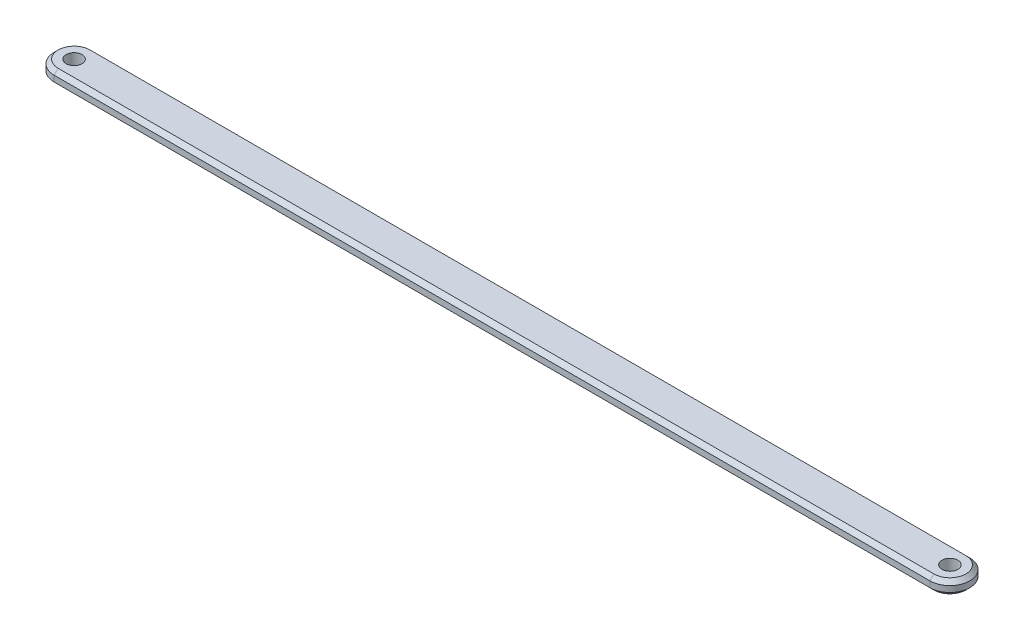
ISO-10303-21;
HEADER;
FILE_DESCRIPTION(('STEP AP214'),'2;1');
FILE_NAME('part.step','',(''),(''),'','','');
FILE_SCHEMA(('AUTOMOTIVE_DESIGN { 1 0 10303 214 1 1 1 1 }'));
ENDSEC;
DATA;
#1=APPLICATION_CONTEXT('core data for automotive mechanical design processes');
#2=APPLICATION_PROTOCOL_DEFINITION('international standard','automotive_design',2000,#1);
#3=PRODUCT_CONTEXT('',#1,'mechanical');
#4=PRODUCT('Part','Part','',(#3));
#5=PRODUCT_RELATED_PRODUCT_CATEGORY('part','',(#4));
#6=PRODUCT_DEFINITION_FORMATION('','',#4);
#7=PRODUCT_DEFINITION_CONTEXT('part definition',#1,'design');
#8=PRODUCT_DEFINITION('design','',#6,#7);
#9=PRODUCT_DEFINITION_SHAPE('','',#8);
#10=(LENGTH_UNIT() NAMED_UNIT(*) SI_UNIT(.MILLI.,.METRE.));
#11=(NAMED_UNIT(*) PLANE_ANGLE_UNIT() SI_UNIT($,.RADIAN.));
#12=(NAMED_UNIT(*) SI_UNIT($,.STERADIAN.) SOLID_ANGLE_UNIT());
#13=UNCERTAINTY_MEASURE_WITH_UNIT(LENGTH_MEASURE(1.E-05),#10,'distance_accuracy_value','');
#14=(GEOMETRIC_REPRESENTATION_CONTEXT(3) GLOBAL_UNCERTAINTY_ASSIGNED_CONTEXT((#13)) GLOBAL_UNIT_ASSIGNED_CONTEXT((#10,
#11,#12)) REPRESENTATION_CONTEXT('',''));
#15=CARTESIAN_POINT('',(0.,0.,0.));
#16=DIRECTION('',(0.,0.,1.));
#17=DIRECTION('',(1.,0.,0.));
#18=AXIS2_PLACEMENT_3D('',#15,#16,#17);
#19=CARTESIAN_POINT('',(0.,3.5,0.));
#20=DIRECTION('',(0.,1.,0.));
#21=DIRECTION('',(0.,0.,1.));
#22=AXIS2_PLACEMENT_3D('',#19,#20,#21);
#23=PLANE('',#22);
#24=DIRECTION('',(1.,0.,0.));
#25=VECTOR('',#24,1.);
#26=CARTESIAN_POINT('',(220.,3.5,4.00000000000006));
#27=LINE('',#26,#25);
#28=CARTESIAN_POINT('',(0.,3.5,4.00000000000003));
#29=VERTEX_POINT('',#28);
#30=CARTESIAN_POINT('',(220.,3.5,4.00000000000006));
#31=VERTEX_POINT('',#30);
#32=EDGE_CURVE('E121',#29,#31,#27,.T.);
#33=ORIENTED_EDGE('',*,*,#32,.T.);
#34=CARTESIAN_POINT('',(220.,3.5,0.));
#35=DIRECTION('',(0.,1.,0.));
#36=DIRECTION('',(0.,0.,1.));
#37=AXIS2_PLACEMENT_3D('',#34,#35,#36);
#38=CIRCLE('',#37,4.00000000000006);
#39=CARTESIAN_POINT('',(220.,3.5,-4.00000000000006));
#40=VERTEX_POINT('',#39);
#41=EDGE_CURVE('E116',#31,#40,#38,.T.);
#42=ORIENTED_EDGE('',*,*,#41,.T.);
#43=DIRECTION('',(-1.,0.,0.));
#44=VECTOR('',#43,1.);
#45=CARTESIAN_POINT('',(0.,3.5,-4.00000000000003));
#46=LINE('',#45,#44);
#47=CARTESIAN_POINT('',(0.,3.5,-4.00000000000003));
#48=VERTEX_POINT('',#47);
#49=EDGE_CURVE('E110',#40,#48,#46,.T.);
#50=ORIENTED_EDGE('',*,*,#49,.T.);
#51=CARTESIAN_POINT('',(0.,3.5,0.));
#52=DIRECTION('',(0.,1.,0.));
#53=DIRECTION('',(0.,0.,1.));
#54=AXIS2_PLACEMENT_3D('',#51,#52,#53);
#55=CIRCLE('',#54,4.00000000000003);
#56=EDGE_CURVE('E113',#48,#29,#55,.T.);
#57=ORIENTED_EDGE('',*,*,#56,.T.);
#58=EDGE_LOOP('',(#33,#42,#50,#57));
#59=FACE_BOUND('',#58,.T.);
#60=CARTESIAN_POINT('',(0.,3.5,0.));
#61=DIRECTION('',(0.,1.,0.));
#62=DIRECTION('',(0.,0.,1.));
#63=AXIS2_PLACEMENT_3D('',#60,#61,#62);
#64=CIRCLE('',#63,2.);
#65=CARTESIAN_POINT('',(0.,3.5,2.));
#66=VERTEX_POINT('',#65);
#67=EDGE_CURVE('E219',#66,#66,#64,.T.);
#68=ORIENTED_EDGE('',*,*,#67,.F.);
#69=EDGE_LOOP('',(#68));
#70=FACE_BOUND('',#69,.T.);
#71=CARTESIAN_POINT('',(220.,3.5,0.));
#72=DIRECTION('',(0.,1.,0.));
#73=DIRECTION('',(0.,0.,-1.));
#74=AXIS2_PLACEMENT_3D('',#71,#72,#73);
#75=CIRCLE('',#74,2.);
#76=CARTESIAN_POINT('',(220.,3.5,-2.00000000000002));
#77=VERTEX_POINT('',#76);
#78=EDGE_CURVE('E224',#77,#77,#75,.T.);
#79=ORIENTED_EDGE('',*,*,#78,.F.);
#80=EDGE_LOOP('',(#79));
#81=FACE_BOUND('',#80,.T.);
#82=ADVANCED_FACE('F41',(#59,#70,#81),#23,.T.);
#83=CARTESIAN_POINT('',(0.,0.,0.));
#84=DIRECTION('',(0.,1.,0.));
#85=DIRECTION('',(0.,0.,1.));
#86=AXIS2_PLACEMENT_3D('',#83,#84,#85);
#87=PLANE('',#86);
#88=DIRECTION('',(1.,0.,0.));
#89=VECTOR('',#88,1.);
#90=CARTESIAN_POINT('',(0.,0.,-4.00000000000003));
#91=LINE('',#90,#89);
#92=CARTESIAN_POINT('',(0.,0.,-4.00000000000003));
#93=VERTEX_POINT('',#92);
#94=CARTESIAN_POINT('',(220.,0.,-4.00000000000006));
#95=VERTEX_POINT('',#94);
#96=EDGE_CURVE('E52',#93,#95,#91,.T.);
#97=ORIENTED_EDGE('',*,*,#96,.T.);
#98=CARTESIAN_POINT('',(220.,0.,0.));
#99=DIRECTION('',(0.,1.,0.));
#100=DIRECTION('',(0.,0.,1.));
#101=AXIS2_PLACEMENT_3D('',#98,#99,#100);
#102=CIRCLE('',#101,4.00000000000006);
#103=CARTESIAN_POINT('',(220.,0.,4.00000000000006));
#104=VERTEX_POINT('',#103);
#105=EDGE_CURVE('E11',#95,#104,#102,.F.);
#106=ORIENTED_EDGE('',*,*,#105,.T.);
#107=DIRECTION('',(-1.,0.,0.));
#108=VECTOR('',#107,1.);
#109=CARTESIAN_POINT('',(0.,0.,4.00000000000003));
#110=LINE('',#109,#108);
#111=CARTESIAN_POINT('',(0.,0.,4.00000000000003));
#112=VERTEX_POINT('',#111);
#113=EDGE_CURVE('E169',#104,#112,#110,.T.);
#114=ORIENTED_EDGE('',*,*,#113,.T.);
#115=CARTESIAN_POINT('',(0.,0.,0.));
#116=DIRECTION('',(0.,1.,0.));
#117=DIRECTION('',(0.,0.,1.));
#118=AXIS2_PLACEMENT_3D('',#115,#116,#117);
#119=CIRCLE('',#118,4.00000000000003);
#120=EDGE_CURVE('E172',#112,#93,#119,.F.);
#121=ORIENTED_EDGE('',*,*,#120,.T.);
#122=EDGE_LOOP('',(#97,#106,#114,#121));
#123=FACE_BOUND('',#122,.T.);
#124=CARTESIAN_POINT('',(0.,0.,0.));
#125=DIRECTION('',(0.,1.,0.));
#126=DIRECTION('',(0.,0.,1.));
#127=AXIS2_PLACEMENT_3D('',#124,#125,#126);
#128=CIRCLE('',#127,2.);
#129=CARTESIAN_POINT('',(0.,0.,2.));
#130=VERTEX_POINT('',#129);
#131=EDGE_CURVE('E220',#130,#130,#128,.T.);
#132=ORIENTED_EDGE('',*,*,#131,.T.);
#133=EDGE_LOOP('',(#132));
#134=FACE_BOUND('',#133,.T.);
#135=CARTESIAN_POINT('',(220.,0.,0.));
#136=DIRECTION('',(0.,1.,0.));
#137=DIRECTION('',(0.,0.,-1.));
#138=AXIS2_PLACEMENT_3D('',#135,#136,#137);
#139=CIRCLE('',#138,2.);
#140=CARTESIAN_POINT('',(220.,0.,-2.00000000000002));
#141=VERTEX_POINT('',#140);
#142=EDGE_CURVE('E142',#141,#141,#139,.T.);
#143=ORIENTED_EDGE('',*,*,#142,.T.);
#144=EDGE_LOOP('',(#143));
#145=FACE_BOUND('',#144,.T.);
#146=ADVANCED_FACE('F239',(#123,#134,#145),#87,.F.);
#147=CARTESIAN_POINT('',(0.,3.5,0.));
#148=DIRECTION('',(0.,-1.,0.));
#149=DIRECTION('',(0.,0.,-1.));
#150=AXIS2_PLACEMENT_3D('',#147,#148,#149);
#151=CYLINDRICAL_SURFACE('',#150,5.);
#152=DIRECTION('',(0.,-1.,0.));
#153=VECTOR('',#152,1.);
#154=CARTESIAN_POINT('',(0.,3.5,5.));
#155=LINE('',#154,#153);
#156=CARTESIAN_POINT('',(0.,2.50000000000001,5.));
#157=VERTEX_POINT('',#156);
#158=CARTESIAN_POINT('',(0.,0.999999999999979,5.));
#159=VERTEX_POINT('',#158);
#160=EDGE_CURVE('E133',#157,#159,#155,.T.);
#161=ORIENTED_EDGE('',*,*,#160,.F.);
#162=CARTESIAN_POINT('',(0.,2.50000000000001,0.));
#163=DIRECTION('',(0.,1.,0.));
#164=DIRECTION('',(0.,0.,1.));
#165=AXIS2_PLACEMENT_3D('',#162,#163,#164);
#166=CIRCLE('',#165,5.);
#167=CARTESIAN_POINT('',(0.,2.50000000000001,-5.));
#168=VERTEX_POINT('',#167);
#169=EDGE_CURVE('E175',#157,#168,#166,.F.);
#170=ORIENTED_EDGE('',*,*,#169,.T.);
#171=DIRECTION('',(0.,-1.,0.));
#172=VECTOR('',#171,1.);
#173=CARTESIAN_POINT('',(0.,3.5,-5.));
#174=LINE('',#173,#172);
#175=CARTESIAN_POINT('',(0.,0.999999999999979,-5.));
#176=VERTEX_POINT('',#175);
#177=EDGE_CURVE('E215',#168,#176,#174,.T.);
#178=ORIENTED_EDGE('',*,*,#177,.T.);
#179=CARTESIAN_POINT('',(0.,0.999999999999979,0.));
#180=DIRECTION('',(0.,1.,0.));
#181=DIRECTION('',(0.,0.,1.));
#182=AXIS2_PLACEMENT_3D('',#179,#180,#181);
#183=CIRCLE('',#182,5.);
#184=EDGE_CURVE('E178',#176,#159,#183,.T.);
#185=ORIENTED_EDGE('',*,*,#184,.T.);
#186=EDGE_LOOP('',(#161,#170,#178,#185));
#187=FACE_BOUND('',#186,.T.);
#188=ADVANCED_FACE('F244',(#187),#151,.T.);
#189=CARTESIAN_POINT('',(0.,3.5,5.));
#190=DIRECTION('',(0.,0.,-1.));
#191=DIRECTION('',(-1.,0.,0.));
#192=AXIS2_PLACEMENT_3D('',#189,#190,#191);
#193=PLANE('',#192);
#194=DIRECTION('',(0.,-1.,0.));
#195=VECTOR('',#194,1.);
#196=CARTESIAN_POINT('',(220.,3.5,5.));
#197=LINE('',#196,#195);
#198=CARTESIAN_POINT('',(220.,2.50000000000001,5.));
#199=VERTEX_POINT('',#198);
#200=CARTESIAN_POINT('',(220.,0.999999999999979,5.));
#201=VERTEX_POINT('',#200);
#202=EDGE_CURVE('E207',#199,#201,#197,.T.);
#203=ORIENTED_EDGE('',*,*,#202,.F.);
#204=DIRECTION('',(-1.,0.,0.));
#205=VECTOR('',#204,1.);
#206=CARTESIAN_POINT('',(0.,2.50000000000001,5.));
#207=LINE('',#206,#205);
#208=EDGE_CURVE('E181',#199,#157,#207,.T.);
#209=ORIENTED_EDGE('',*,*,#208,.T.);
#210=ORIENTED_EDGE('',*,*,#160,.T.);
#211=DIRECTION('',(1.,0.,0.));
#212=VECTOR('',#211,1.);
#213=CARTESIAN_POINT('',(0.,0.999999999999979,5.));
#214=LINE('',#213,#212);
#215=EDGE_CURVE('E184',#159,#201,#214,.T.);
#216=ORIENTED_EDGE('',*,*,#215,.T.);
#217=EDGE_LOOP('',(#203,#209,#210,#216));
#218=FACE_BOUND('',#217,.T.);
#219=ADVANCED_FACE('F257',(#218),#193,.F.);
#220=CARTESIAN_POINT('',(220.,3.5,0.));
#221=DIRECTION('',(0.,-1.,0.));
#222=DIRECTION('',(0.,0.,-1.));
#223=AXIS2_PLACEMENT_3D('',#220,#221,#222);
#224=CYLINDRICAL_SURFACE('',#223,5.00000000000003);
#225=DIRECTION('',(0.,-1.,0.));
#226=VECTOR('',#225,1.);
#227=CARTESIAN_POINT('',(220.,3.5,-5.00000000000003));
#228=LINE('',#227,#226);
#229=CARTESIAN_POINT('',(220.,2.50000000000001,-5.00000000000003));
#230=VERTEX_POINT('',#229);
#231=CARTESIAN_POINT('',(220.,0.999999999999979,-5.00000000000003));
#232=VERTEX_POINT('',#231);
#233=EDGE_CURVE('E211',#230,#232,#228,.T.);
#234=ORIENTED_EDGE('',*,*,#233,.F.);
#235=CARTESIAN_POINT('',(220.,2.50000000000001,0.));
#236=DIRECTION('',(0.,1.,0.));
#237=DIRECTION('',(0.,0.,1.));
#238=AXIS2_PLACEMENT_3D('',#235,#236,#237);
#239=CIRCLE('',#238,5.00000000000003);
#240=EDGE_CURVE('E192',#230,#199,#239,.F.);
#241=ORIENTED_EDGE('',*,*,#240,.T.);
#242=ORIENTED_EDGE('',*,*,#202,.T.);
#243=CARTESIAN_POINT('',(220.,0.999999999999979,0.));
#244=DIRECTION('',(0.,1.,0.));
#245=DIRECTION('',(0.,0.,1.));
#246=AXIS2_PLACEMENT_3D('',#243,#244,#245);
#247=CIRCLE('',#246,5.00000000000003);
#248=EDGE_CURVE('E196',#201,#232,#247,.T.);
#249=ORIENTED_EDGE('',*,*,#248,.T.);
#250=EDGE_LOOP('',(#234,#241,#242,#249));
#251=FACE_BOUND('',#250,.T.);
#252=ADVANCED_FACE('F253',(#251),#224,.T.);
#253=CARTESIAN_POINT('',(0.,3.5,-5.));
#254=DIRECTION('',(0.,0.,1.));
#255=DIRECTION('',(1.,0.,0.));
#256=AXIS2_PLACEMENT_3D('',#253,#254,#255);
#257=PLANE('',#256);
#258=ORIENTED_EDGE('',*,*,#177,.F.);
#259=DIRECTION('',(1.,0.,0.));
#260=VECTOR('',#259,1.);
#261=CARTESIAN_POINT('',(220.,2.50000000000001,-5.00000000000003));
#262=LINE('',#261,#260);
#263=EDGE_CURVE('E136',#168,#230,#262,.T.);
#264=ORIENTED_EDGE('',*,*,#263,.T.);
#265=ORIENTED_EDGE('',*,*,#233,.T.);
#266=DIRECTION('',(-1.,0.,0.));
#267=VECTOR('',#266,1.);
#268=CARTESIAN_POINT('',(0.,0.999999999999979,-5.));
#269=LINE('',#268,#267);
#270=EDGE_CURVE('E189',#232,#176,#269,.T.);
#271=ORIENTED_EDGE('',*,*,#270,.T.);
#272=EDGE_LOOP('',(#258,#264,#265,#271));
#273=FACE_BOUND('',#272,.T.);
#274=ADVANCED_FACE('F250',(#273),#257,.F.);
#275=CARTESIAN_POINT('',(0.,3.5,0.));
#276=DIRECTION('',(0.,-1.,0.));
#277=DIRECTION('',(0.,0.,-1.));
#278=AXIS2_PLACEMENT_3D('',#275,#276,#277);
#279=CYLINDRICAL_SURFACE('',#278,2.);
#280=ORIENTED_EDGE('',*,*,#67,.T.);
#281=EDGE_LOOP('',(#280));
#282=FACE_BOUND('',#281,.T.);
#283=ORIENTED_EDGE('',*,*,#131,.F.);
#284=EDGE_LOOP('',(#283));
#285=FACE_BOUND('',#284,.T.);
#286=ADVANCED_FACE('F247',(#282,#285),#279,.F.);
#287=CARTESIAN_POINT('',(220.,3.5,0.));
#288=DIRECTION('',(0.,-1.,0.));
#289=DIRECTION('',(0.,0.,-1.));
#290=AXIS2_PLACEMENT_3D('',#287,#288,#289);
#291=CYLINDRICAL_SURFACE('',#290,2.);
#292=ORIENTED_EDGE('',*,*,#78,.T.);
#293=EDGE_LOOP('',(#292));
#294=FACE_BOUND('',#293,.T.);
#295=ORIENTED_EDGE('',*,*,#142,.F.);
#296=EDGE_LOOP('',(#295));
#297=FACE_BOUND('',#296,.T.);
#298=ADVANCED_FACE('F235',(#294,#297),#291,.F.);
#299=CARTESIAN_POINT('',(0.,3.5,0.));
#300=DIRECTION('',(0.,-1.,0.));
#301=DIRECTION('',(0.,0.,-1.));
#302=AXIS2_PLACEMENT_3D('',#299,#300,#301);
#303=CONICAL_SURFACE('',#302,4.00000000000003,0.78539816339744);
#304=DIRECTION('',(0.,0.707106781186554,0.707106781186541));
#305=VECTOR('',#304,1.);
#306=CARTESIAN_POINT('',(0.,2.50000000000001,-5.));
#307=LINE('',#306,#305);
#308=EDGE_CURVE('E127',#168,#48,#307,.T.);
#309=ORIENTED_EDGE('',*,*,#308,.F.);
#310=ORIENTED_EDGE('',*,*,#169,.F.);
#311=DIRECTION('',(0.,-0.707106781186554,0.707106781186541));
#312=VECTOR('',#311,1.);
#313=CARTESIAN_POINT('',(0.,3.5,4.00000000000003));
#314=LINE('',#313,#312);
#315=EDGE_CURVE('E130',#29,#157,#314,.T.);
#316=ORIENTED_EDGE('',*,*,#315,.F.);
#317=ORIENTED_EDGE('',*,*,#56,.F.);
#318=EDGE_LOOP('',(#309,#310,#316,#317));
#319=FACE_BOUND('',#318,.T.);
#320=ADVANCED_FACE('F125',(#319),#303,.T.);
#321=CARTESIAN_POINT('',(0.,3.5,4.00000000000003));
#322=DIRECTION('',(0.,0.707106781186541,0.707106781186554));
#323=DIRECTION('',(-1.,0.,0.));
#324=AXIS2_PLACEMENT_3D('',#321,#322,#323);
#325=PLANE('',#324);
#326=ORIENTED_EDGE('',*,*,#315,.T.);
#327=ORIENTED_EDGE('',*,*,#208,.F.);
#328=DIRECTION('',(0.,-0.707106781186554,0.707106781186541));
#329=VECTOR('',#328,1.);
#330=CARTESIAN_POINT('',(220.,3.5,4.00000000000006));
#331=LINE('',#330,#329);
#332=EDGE_CURVE('E138',#31,#199,#331,.T.);
#333=ORIENTED_EDGE('',*,*,#332,.F.);
#334=ORIENTED_EDGE('',*,*,#32,.F.);
#335=EDGE_LOOP('',(#326,#327,#333,#334));
#336=FACE_BOUND('',#335,.T.);
#337=ADVANCED_FACE('F277',(#336),#325,.T.);
#338=CARTESIAN_POINT('',(0.,3.5,-4.00000000000003));
#339=DIRECTION('',(0.,0.707106781186541,-0.707106781186554));
#340=DIRECTION('',(1.,0.,0.));
#341=AXIS2_PLACEMENT_3D('',#338,#339,#340);
#342=PLANE('',#341);
#343=ORIENTED_EDGE('',*,*,#308,.T.);
#344=ORIENTED_EDGE('',*,*,#49,.F.);
#345=DIRECTION('',(0.,0.707106781186554,0.707106781186541));
#346=VECTOR('',#345,1.);
#347=CARTESIAN_POINT('',(220.,2.50000000000001,-5.00000000000003));
#348=LINE('',#347,#346);
#349=EDGE_CURVE('E144',#230,#40,#348,.T.);
#350=ORIENTED_EDGE('',*,*,#349,.F.);
#351=ORIENTED_EDGE('',*,*,#263,.F.);
#352=EDGE_LOOP('',(#343,#344,#350,#351));
#353=FACE_BOUND('',#352,.T.);
#354=ADVANCED_FACE('F135',(#353),#342,.T.);
#355=CARTESIAN_POINT('',(220.,3.5,0.));
#356=DIRECTION('',(0.,-1.,0.));
#357=DIRECTION('',(0.,0.,-1.));
#358=AXIS2_PLACEMENT_3D('',#355,#356,#357);
#359=CONICAL_SURFACE('',#358,4.00000000000006,0.78539816339744);
#360=ORIENTED_EDGE('',*,*,#332,.T.);
#361=ORIENTED_EDGE('',*,*,#240,.F.);
#362=ORIENTED_EDGE('',*,*,#349,.T.);
#363=ORIENTED_EDGE('',*,*,#41,.F.);
#364=EDGE_LOOP('',(#360,#361,#362,#363));
#365=FACE_BOUND('',#364,.T.);
#366=ADVANCED_FACE('F266',(#365),#359,.T.);
#367=CARTESIAN_POINT('',(0.,0.999999999999979,0.));
#368=DIRECTION('',(0.,1.,0.));
#369=DIRECTION('',(0.,0.,1.));
#370=AXIS2_PLACEMENT_3D('',#367,#368,#369);
#371=CONICAL_SURFACE('',#370,5.,0.785398163397443);
#372=DIRECTION('',(0.,0.707106781186551,-0.707106781186544));
#373=VECTOR('',#372,1.);
#374=CARTESIAN_POINT('',(0.,0.,-4.00000000000003));
#375=LINE('',#374,#373);
#376=EDGE_CURVE('E152',#93,#176,#375,.T.);
#377=ORIENTED_EDGE('',*,*,#376,.F.);
#378=ORIENTED_EDGE('',*,*,#120,.F.);
#379=DIRECTION('',(0.,-0.707106781186551,-0.707106781186544));
#380=VECTOR('',#379,1.);
#381=CARTESIAN_POINT('',(0.,0.999999999999979,5.));
#382=LINE('',#381,#380);
#383=EDGE_CURVE('E46',#159,#112,#382,.T.);
#384=ORIENTED_EDGE('',*,*,#383,.F.);
#385=ORIENTED_EDGE('',*,*,#184,.F.);
#386=EDGE_LOOP('',(#377,#378,#384,#385));
#387=FACE_BOUND('',#386,.T.);
#388=ADVANCED_FACE('F44',(#387),#371,.T.);
#389=CARTESIAN_POINT('',(0.,0.999999999999979,5.));
#390=DIRECTION('',(0.,0.707106781186544,-0.707106781186551));
#391=DIRECTION('',(1.,0.,0.));
#392=AXIS2_PLACEMENT_3D('',#389,#390,#391);
#393=PLANE('',#392);
#394=ORIENTED_EDGE('',*,*,#383,.T.);
#395=ORIENTED_EDGE('',*,*,#113,.F.);
#396=DIRECTION('',(0.,-0.707106781186551,-0.707106781186544));
#397=VECTOR('',#396,1.);
#398=CARTESIAN_POINT('',(220.,0.999999999999979,5.00000000000003));
#399=LINE('',#398,#397);
#400=EDGE_CURVE('E65',#201,#104,#399,.T.);
#401=ORIENTED_EDGE('',*,*,#400,.F.);
#402=ORIENTED_EDGE('',*,*,#215,.F.);
#403=EDGE_LOOP('',(#394,#395,#401,#402));
#404=FACE_BOUND('',#403,.T.);
#405=ADVANCED_FACE('F300',(#404),#393,.F.);
#406=CARTESIAN_POINT('',(0.,0.999999999999979,-5.));
#407=DIRECTION('',(0.,0.707106781186544,0.707106781186551));
#408=DIRECTION('',(-1.,0.,0.));
#409=AXIS2_PLACEMENT_3D('',#406,#407,#408);
#410=PLANE('',#409);
#411=ORIENTED_EDGE('',*,*,#376,.T.);
#412=ORIENTED_EDGE('',*,*,#270,.F.);
#413=DIRECTION('',(0.,0.707106781186551,-0.707106781186544));
#414=VECTOR('',#413,1.);
#415=CARTESIAN_POINT('',(220.,0.,-4.00000000000006));
#416=LINE('',#415,#414);
#417=EDGE_CURVE('E148',#95,#232,#416,.T.);
#418=ORIENTED_EDGE('',*,*,#417,.F.);
#419=ORIENTED_EDGE('',*,*,#96,.F.);
#420=EDGE_LOOP('',(#411,#412,#418,#419));
#421=FACE_BOUND('',#420,.T.);
#422=ADVANCED_FACE('F295',(#421),#410,.F.);
#423=CARTESIAN_POINT('',(220.,0.999999999999979,0.));
#424=DIRECTION('',(0.,1.,0.));
#425=DIRECTION('',(0.,0.,1.));
#426=AXIS2_PLACEMENT_3D('',#423,#424,#425);
#427=CONICAL_SURFACE('',#426,5.00000000000003,0.785398163397443);
#428=ORIENTED_EDGE('',*,*,#400,.T.);
#429=ORIENTED_EDGE('',*,*,#105,.F.);
#430=ORIENTED_EDGE('',*,*,#417,.T.);
#431=ORIENTED_EDGE('',*,*,#248,.F.);
#432=EDGE_LOOP('',(#428,#429,#430,#431));
#433=FACE_BOUND('',#432,.T.);
#434=ADVANCED_FACE('F289',(#433),#427,.T.);
#435=CLOSED_SHELL('',(#82,#146,#188,#219,#252,#274,#286,#298,#320,#337,#354,#366,#388,#405,#422,#434));
#436=MANIFOLD_SOLID_BREP('B2',#435);
#437=ADVANCED_BREP_SHAPE_REPRESENTATION('',(#18,#436),#14);
#438=SHAPE_DEFINITION_REPRESENTATION(#9,#437);
ENDSEC;
END-ISO-10303-21;
